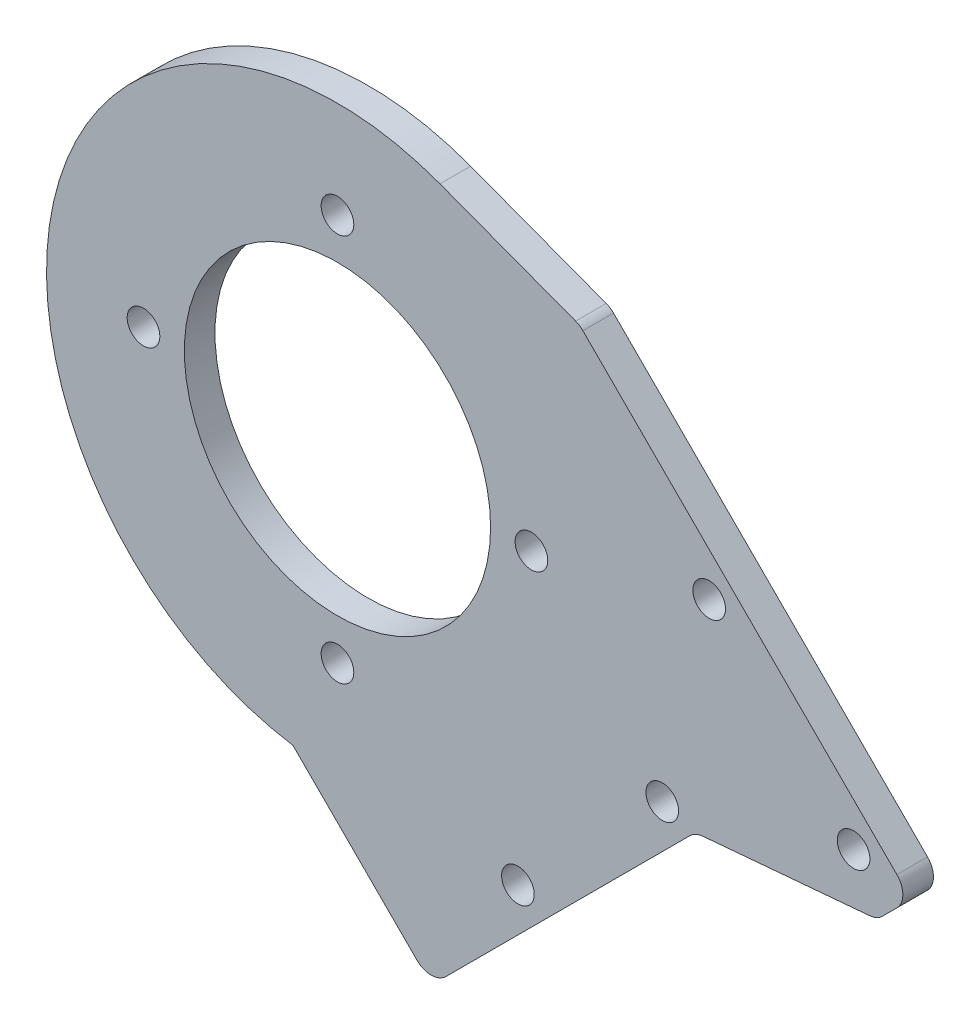
ISO-10303-21;
HEADER;
FILE_DESCRIPTION(('STEP AP214'),'2;1');
FILE_NAME('part.step','',(''),(''),'','','');
FILE_SCHEMA(('AUTOMOTIVE_DESIGN { 1 0 10303 214 1 1 1 1 }'));
ENDSEC;
DATA;
#1=APPLICATION_CONTEXT('core data for automotive mechanical design processes');
#2=APPLICATION_PROTOCOL_DEFINITION('international standard','automotive_design',2000,#1);
#3=PRODUCT_CONTEXT('',#1,'mechanical');
#4=PRODUCT('Part','Part','',(#3));
#5=PRODUCT_RELATED_PRODUCT_CATEGORY('part','',(#4));
#6=PRODUCT_DEFINITION_FORMATION('','',#4);
#7=PRODUCT_DEFINITION_CONTEXT('part definition',#1,'design');
#8=PRODUCT_DEFINITION('design','',#6,#7);
#9=PRODUCT_DEFINITION_SHAPE('','',#8);
#10=(LENGTH_UNIT() NAMED_UNIT(*) SI_UNIT(.MILLI.,.METRE.));
#11=(NAMED_UNIT(*) PLANE_ANGLE_UNIT() SI_UNIT($,.RADIAN.));
#12=(NAMED_UNIT(*) SI_UNIT($,.STERADIAN.) SOLID_ANGLE_UNIT());
#13=UNCERTAINTY_MEASURE_WITH_UNIT(LENGTH_MEASURE(1.E-05),#10,'distance_accuracy_value','');
#14=(GEOMETRIC_REPRESENTATION_CONTEXT(3) GLOBAL_UNCERTAINTY_ASSIGNED_CONTEXT((#13)) GLOBAL_UNIT_ASSIGNED_CONTEXT((#10,
#11,#12)) REPRESENTATION_CONTEXT('',''));
#15=CARTESIAN_POINT('',(0.,0.,0.));
#16=DIRECTION('',(0.,0.,1.));
#17=DIRECTION('',(1.,0.,0.));
#18=AXIS2_PLACEMENT_3D('',#15,#16,#17);
#19=CARTESIAN_POINT('',(0.,0.,3.));
#20=DIRECTION('',(0.,0.,-1.));
#21=DIRECTION('',(-1.,0.,0.));
#22=AXIS2_PLACEMENT_3D('',#19,#20,#21);
#23=CYLINDRICAL_SURFACE('',#22,28.5);
#24=CARTESIAN_POINT('',(0.,0.,3.));
#25=DIRECTION('',(0.,0.,1.));
#26=DIRECTION('',(1.,0.,0.));
#27=AXIS2_PLACEMENT_3D('',#24,#25,#26);
#28=CIRCLE('',#27,28.5);
#29=CARTESIAN_POINT('',(10.0381860912643,26.6736727879223,3.));
#30=VERTEX_POINT('',#29);
#31=CARTESIAN_POINT('',(-4.36282573187883,-28.1640862027025,3.));
#32=VERTEX_POINT('',#31);
#33=EDGE_CURVE('E11',#30,#32,#28,.T.);
#34=ORIENTED_EDGE('',*,*,#33,.F.);
#35=DIRECTION('',(0.,0.,1.));
#36=VECTOR('',#35,1.);
#37=CARTESIAN_POINT('',(10.0381860912643,26.6736727879223,-14.8069801070603));
#38=LINE('',#37,#36);
#39=CARTESIAN_POINT('',(10.0381860912643,26.6736727879223,0.));
#40=VERTEX_POINT('',#39);
#41=EDGE_CURVE('E135',#40,#30,#38,.T.);
#42=ORIENTED_EDGE('',*,*,#41,.F.);
#43=CARTESIAN_POINT('',(0.,0.,0.));
#44=DIRECTION('',(0.,0.,1.));
#45=DIRECTION('',(1.,0.,0.));
#46=AXIS2_PLACEMENT_3D('',#43,#44,#45);
#47=CIRCLE('',#46,28.5);
#48=CARTESIAN_POINT('',(-4.36282573187883,-28.1640862027025,0.));
#49=VERTEX_POINT('',#48);
#50=EDGE_CURVE('E49',#40,#49,#47,.T.);
#51=ORIENTED_EDGE('',*,*,#50,.T.);
#52=DIRECTION('',(0.,0.,1.));
#53=VECTOR('',#52,1.);
#54=CARTESIAN_POINT('',(-4.36282573187883,-28.1640862027025,-86.6025879209311));
#55=LINE('',#54,#53);
#56=EDGE_CURVE('E196',#49,#32,#55,.T.);
#57=ORIENTED_EDGE('',*,*,#56,.T.);
#58=EDGE_LOOP('',(#34,#42,#51,#57));
#59=FACE_BOUND('',#58,.T.);
#60=ADVANCED_FACE('F46',(#59),#23,.T.);
#61=CARTESIAN_POINT('',(0.,0.,3.));
#62=DIRECTION('',(0.,0.,1.));
#63=DIRECTION('',(1.,0.,0.));
#64=AXIS2_PLACEMENT_3D('',#61,#62,#63);
#65=PLANE('',#64);
#66=DIRECTION('',(-0.935918343435871,0.352217055833836,0.));
#67=VECTOR('',#66,1.);
#68=CARTESIAN_POINT('',(10.0381860912643,26.6736727879223,3.));
#69=LINE('',#68,#67);
#70=CARTESIAN_POINT('',(23.3318511096373,21.670826560095,3.));
#71=VERTEX_POINT('',#70);
#72=EDGE_CURVE('E133',#71,#30,#69,.T.);
#73=ORIENTED_EDGE('',*,*,#72,.T.);
#74=ORIENTED_EDGE('',*,*,#33,.T.);
#75=DIRECTION('',(-0.707106781186544,0.707106781186551,0.));
#76=VECTOR('',#75,1.);
#77=CARTESIAN_POINT('',(-16.2634559672907,-16.2634559672905,3.));
#78=LINE('',#77,#76);
#79=CARTESIAN_POINT('',(7.77817459305182,-40.3050865276332,3.));
#80=VERTEX_POINT('',#79);
#81=EDGE_CURVE('E172',#80,#32,#78,.T.);
#82=ORIENTED_EDGE('',*,*,#81,.F.);
#83=CARTESIAN_POINT('',(9.19238815542492,-38.8908729652602,3.));
#84=DIRECTION('',(0.,0.,1.));
#85=DIRECTION('',(1.,0.,0.));
#86=AXIS2_PLACEMENT_3D('',#83,#84,#85);
#87=CIRCLE('',#86,2.00000000000001);
#88=CARTESIAN_POINT('',(10.606601717798,-40.3050865276333,3.));
#89=VERTEX_POINT('',#88);
#90=EDGE_CURVE('E235',#89,#80,#87,.F.);
#91=ORIENTED_EDGE('',*,*,#90,.F.);
#92=DIRECTION('',(0.707106781186551,0.707106781186544,0.));
#93=VECTOR('',#92,1.);
#94=CARTESIAN_POINT('',(25.4558441227156,-25.4558441227158,3.));
#95=LINE('',#94,#93);
#96=CARTESIAN_POINT('',(34.5343546742321,-16.3773335711994,3.));
#97=VERTEX_POINT('',#96);
#98=EDGE_CURVE('E157',#89,#97,#95,.T.);
#99=ORIENTED_EDGE('',*,*,#98,.T.);
#100=CARTESIAN_POINT('',(35.9485682366052,-17.7915471335725,3.));
#101=DIRECTION('',(0.,0.,1.));
#102=DIRECTION('',(1.,0.,0.));
#103=AXIS2_PLACEMENT_3D('',#100,#101,#102);
#104=CIRCLE('',#103,2.00000000000001);
#105=CARTESIAN_POINT('',(35.7742567511099,-15.799157737389,3.));
#106=VERTEX_POINT('',#105);
#107=EDGE_CURVE('E164',#97,#106,#104,.F.);
#108=ORIENTED_EDGE('',*,*,#107,.T.);
#109=DIRECTION('',(0.996194698091746,0.0871557427476517,0.));
#110=VECTOR('',#109,1.);
#111=CARTESIAN_POINT('',(1.64349314706863,-18.7852126302256,3.));
#112=LINE('',#111,#110);
#113=CARTESIAN_POINT('',(52.1466599027065,-14.3667580669483,3.));
#114=VERTEX_POINT('',#113);
#115=EDGE_CURVE('E349',#106,#114,#112,.T.);
#116=ORIENTED_EDGE('',*,*,#115,.T.);
#117=CARTESIAN_POINT('',(51.9723484172112,-12.3743686707648,3.));
#118=DIRECTION('',(0.,0.,1.));
#119=DIRECTION('',(1.,0.,0.));
#120=AXIS2_PLACEMENT_3D('',#117,#118,#119);
#121=CIRCLE('',#120,2.);
#122=CARTESIAN_POINT('',(53.3865619795843,-13.7885822331379,3.));
#123=VERTEX_POINT('',#122);
#124=EDGE_CURVE('E259',#114,#123,#121,.T.);
#125=ORIENTED_EDGE('',*,*,#124,.T.);
#126=DIRECTION('',(-0.707106781186554,-0.707106781186542,0.));
#127=VECTOR('',#126,1.);
#128=CARTESIAN_POINT('',(33.5875721063607,-33.5875721063612,3.));
#129=LINE('',#128,#127);
#130=CARTESIAN_POINT('',(54.8007755419574,-12.3743686707649,3.));
#131=VERTEX_POINT('',#130);
#132=EDGE_CURVE('E217',#131,#123,#129,.T.);
#133=ORIENTED_EDGE('',*,*,#132,.F.);
#134=CARTESIAN_POINT('',(53.3865619795843,-10.9601551083918,3.));
#135=DIRECTION('',(0.,0.,1.));
#136=DIRECTION('',(1.,0.,0.));
#137=AXIS2_PLACEMENT_3D('',#134,#135,#136);
#138=CIRCLE('',#137,2.00000000000001);
#139=CARTESIAN_POINT('',(54.8007755419574,-9.54594154601867,3.));
#140=VERTEX_POINT('',#139);
#141=EDGE_CURVE('E213',#140,#131,#138,.F.);
#142=ORIENTED_EDGE('',*,*,#141,.F.);
#143=DIRECTION('',(0.707106781186544,-0.707106781186551,0.));
#144=VECTOR('',#143,1.);
#145=CARTESIAN_POINT('',(22.6274169979696,22.6274169979694,3.));
#146=LINE('',#145,#144);
#147=CARTESIAN_POINT('',(24.0416305603427,21.2132034355963,3.));
#148=VERTEX_POINT('',#147);
#149=EDGE_CURVE('E155',#148,#140,#146,.T.);
#150=ORIENTED_EDGE('',*,*,#149,.F.);
#151=CARTESIAN_POINT('',(22.6274169979696,19.7989898732232,3.));
#152=DIRECTION('',(0.,0.,1.));
#153=DIRECTION('',(1.,0.,0.));
#154=AXIS2_PLACEMENT_3D('',#151,#152,#153);
#155=CIRCLE('',#154,2.);
#156=EDGE_CURVE('E146',#148,#71,#155,.T.);
#157=ORIENTED_EDGE('',*,*,#156,.T.);
#158=EDGE_LOOP('',(#73,#74,#82,#91,#99,#108,#116,#125,#133,#142,#150,#157));
#159=FACE_BOUND('',#158,.T.);
#160=CARTESIAN_POINT('',(0.,-19.,3.));
#161=DIRECTION('',(0.,0.,1.));
#162=DIRECTION('',(1.,0.,0.));
#163=AXIS2_PLACEMENT_3D('',#160,#161,#162);
#164=CIRCLE('',#163,1.60000000000013);
#165=CARTESIAN_POINT('',(1.60000000000013,-19.,3.));
#166=VERTEX_POINT('',#165);
#167=EDGE_CURVE('E281',#166,#166,#164,.T.);
#168=ORIENTED_EDGE('',*,*,#167,.F.);
#169=EDGE_LOOP('',(#168));
#170=FACE_BOUND('',#169,.T.);
#171=CARTESIAN_POINT('',(0.,0.,3.));
#172=DIRECTION('',(0.,0.,1.));
#173=DIRECTION('',(1.,0.,0.));
#174=AXIS2_PLACEMENT_3D('',#171,#172,#173);
#175=CIRCLE('',#174,15.);
#176=CARTESIAN_POINT('',(15.,0.,3.));
#177=VERTEX_POINT('',#176);
#178=EDGE_CURVE('E296',#177,#177,#175,.T.);
#179=ORIENTED_EDGE('',*,*,#178,.F.);
#180=EDGE_LOOP('',(#179));
#181=FACE_BOUND('',#180,.T.);
#182=CARTESIAN_POINT('',(0.,19.,3.));
#183=DIRECTION('',(0.,0.,1.));
#184=DIRECTION('',(1.,0.,0.));
#185=AXIS2_PLACEMENT_3D('',#182,#183,#184);
#186=CIRCLE('',#185,1.6);
#187=CARTESIAN_POINT('',(1.6,19.,3.));
#188=VERTEX_POINT('',#187);
#189=EDGE_CURVE('E304',#188,#188,#186,.T.);
#190=ORIENTED_EDGE('',*,*,#189,.F.);
#191=EDGE_LOOP('',(#190));
#192=FACE_BOUND('',#191,.T.);
#193=CARTESIAN_POINT('',(19.,0.,3.));
#194=DIRECTION('',(0.,0.,1.));
#195=DIRECTION('',(1.,0.,0.));
#196=AXIS2_PLACEMENT_3D('',#193,#194,#195);
#197=CIRCLE('',#196,1.6);
#198=CARTESIAN_POINT('',(20.6,0.,3.));
#199=VERTEX_POINT('',#198);
#200=EDGE_CURVE('E288',#199,#199,#197,.T.);
#201=ORIENTED_EDGE('',*,*,#200,.F.);
#202=EDGE_LOOP('',(#201));
#203=FACE_BOUND('',#202,.T.);
#204=CARTESIAN_POINT('',(-19.,1.99014436314059E-13,3.));
#205=DIRECTION('',(0.,0.,1.));
#206=DIRECTION('',(1.,0.,0.));
#207=AXIS2_PLACEMENT_3D('',#204,#205,#206);
#208=CIRCLE('',#207,1.6);
#209=CARTESIAN_POINT('',(-17.4,1.99014436314059E-13,3.));
#210=VERTEX_POINT('',#209);
#211=EDGE_CURVE('E273',#210,#210,#208,.T.);
#212=ORIENTED_EDGE('',*,*,#211,.F.);
#213=EDGE_LOOP('',(#212));
#214=FACE_BOUND('',#213,.T.);
#215=CARTESIAN_POINT('',(31.8198051533946,-14.8492424049177,3.));
#216=DIRECTION('',(0.,0.,1.));
#217=DIRECTION('',(1.,0.,0.));
#218=AXIS2_PLACEMENT_3D('',#215,#216,#217);
#219=CIRCLE('',#218,1.59999999999999);
#220=CARTESIAN_POINT('',(33.4198051533946,-14.8492424049177,3.));
#221=VERTEX_POINT('',#220);
#222=EDGE_CURVE('E158',#221,#221,#219,.T.);
#223=ORIENTED_EDGE('',*,*,#222,.F.);
#224=EDGE_LOOP('',(#223));
#225=FACE_BOUND('',#224,.T.);
#226=CARTESIAN_POINT('',(17.6776695296635,-28.9913780286485,3.));
#227=DIRECTION('',(0.,0.,1.));
#228=DIRECTION('',(1.,0.,0.));
#229=AXIS2_PLACEMENT_3D('',#226,#227,#228);
#230=CIRCLE('',#229,1.59999999999999);
#231=CARTESIAN_POINT('',(19.2776695296635,-28.9913780286485,3.));
#232=VERTEX_POINT('',#231);
#233=EDGE_CURVE('E189',#232,#232,#230,.T.);
#234=ORIENTED_EDGE('',*,*,#233,.F.);
#235=EDGE_LOOP('',(#234));
#236=FACE_BOUND('',#235,.T.);
#237=CARTESIAN_POINT('',(50.5581348548377,-9.54594154601909,3.));
#238=DIRECTION('',(0.,0.,1.));
#239=DIRECTION('',(1.,0.,0.));
#240=AXIS2_PLACEMENT_3D('',#237,#238,#239);
#241=CIRCLE('',#240,1.59999999999999);
#242=CARTESIAN_POINT('',(52.1581348548377,-9.54594154601909,3.));
#243=VERTEX_POINT('',#242);
#244=EDGE_CURVE('E184',#243,#243,#241,.T.);
#245=ORIENTED_EDGE('',*,*,#244,.F.);
#246=EDGE_LOOP('',(#245));
#247=FACE_BOUND('',#246,.T.);
#248=CARTESIAN_POINT('',(36.4159992311068,4.59619407771193,3.));
#249=DIRECTION('',(0.,0.,1.));
#250=DIRECTION('',(1.,0.,0.));
#251=AXIS2_PLACEMENT_3D('',#248,#249,#250);
#252=CIRCLE('',#251,1.60000000000002);
#253=CARTESIAN_POINT('',(38.0159992311068,4.59619407771193,3.));
#254=VERTEX_POINT('',#253);
#255=EDGE_CURVE('E178',#254,#254,#252,.T.);
#256=ORIENTED_EDGE('',*,*,#255,.F.);
#257=EDGE_LOOP('',(#256));
#258=FACE_BOUND('',#257,.T.);
#259=ADVANCED_FACE('F151',(#159,#170,#181,#192,#203,#214,#225,#236,#247,#258),#65,.T.);
#260=CARTESIAN_POINT('',(0.,0.,0.));
#261=DIRECTION('',(0.,0.,1.));
#262=DIRECTION('',(1.,0.,0.));
#263=AXIS2_PLACEMENT_3D('',#260,#261,#262);
#264=PLANE('',#263);
#265=ORIENTED_EDGE('',*,*,#50,.F.);
#266=DIRECTION('',(0.935918343435871,-0.352217055833836,0.));
#267=VECTOR('',#266,1.);
#268=CARTESIAN_POINT('',(10.0381860912643,26.6736727879223,0.));
#269=LINE('',#268,#267);
#270=CARTESIAN_POINT('',(23.3318511096373,21.670826560095,0.));
#271=VERTEX_POINT('',#270);
#272=EDGE_CURVE('E248',#40,#271,#269,.T.);
#273=ORIENTED_EDGE('',*,*,#272,.T.);
#274=CARTESIAN_POINT('',(22.6274169979696,19.7989898732232,0.));
#275=DIRECTION('',(0.,0.,1.));
#276=DIRECTION('',(1.,0.,0.));
#277=AXIS2_PLACEMENT_3D('',#274,#275,#276);
#278=CIRCLE('',#277,2.);
#279=CARTESIAN_POINT('',(24.0416305603427,21.2132034355963,0.));
#280=VERTEX_POINT('',#279);
#281=EDGE_CURVE('E147',#271,#280,#278,.F.);
#282=ORIENTED_EDGE('',*,*,#281,.T.);
#283=DIRECTION('',(-0.707106781186544,0.707106781186551,0.));
#284=VECTOR('',#283,1.);
#285=CARTESIAN_POINT('',(22.6274169979696,22.6274169979694,0.));
#286=LINE('',#285,#284);
#287=CARTESIAN_POINT('',(54.8007755419574,-9.54594154601866,0.));
#288=VERTEX_POINT('',#287);
#289=EDGE_CURVE('E244',#288,#280,#286,.T.);
#290=ORIENTED_EDGE('',*,*,#289,.F.);
#291=CARTESIAN_POINT('',(53.3865619795843,-10.9601551083918,0.));
#292=DIRECTION('',(0.,0.,1.));
#293=DIRECTION('',(1.,0.,0.));
#294=AXIS2_PLACEMENT_3D('',#291,#292,#293);
#295=CIRCLE('',#294,2.00000000000001);
#296=CARTESIAN_POINT('',(54.8007755419574,-12.3743686707649,0.));
#297=VERTEX_POINT('',#296);
#298=EDGE_CURVE('E176',#297,#288,#295,.T.);
#299=ORIENTED_EDGE('',*,*,#298,.F.);
#300=DIRECTION('',(0.707106781186554,0.707106781186542,0.));
#301=VECTOR('',#300,1.);
#302=CARTESIAN_POINT('',(33.5875721063607,-33.5875721063612,0.));
#303=LINE('',#302,#301);
#304=CARTESIAN_POINT('',(53.3865619795843,-13.7885822331379,0.));
#305=VERTEX_POINT('',#304);
#306=EDGE_CURVE('E218',#305,#297,#303,.T.);
#307=ORIENTED_EDGE('',*,*,#306,.F.);
#308=CARTESIAN_POINT('',(51.9723484172112,-12.3743686707648,0.));
#309=DIRECTION('',(0.,0.,1.));
#310=DIRECTION('',(1.,0.,0.));
#311=AXIS2_PLACEMENT_3D('',#308,#309,#310);
#312=CIRCLE('',#311,2.);
#313=CARTESIAN_POINT('',(52.1466599027065,-14.3667580669483,0.));
#314=VERTEX_POINT('',#313);
#315=EDGE_CURVE('E255',#305,#314,#312,.F.);
#316=ORIENTED_EDGE('',*,*,#315,.T.);
#317=DIRECTION('',(-0.996194698091746,-0.0871557427476517,0.));
#318=VECTOR('',#317,1.);
#319=CARTESIAN_POINT('',(1.64349314706863,-18.7852126302256,0.));
#320=LINE('',#319,#318);
#321=CARTESIAN_POINT('',(35.7742567511099,-15.799157737389,0.));
#322=VERTEX_POINT('',#321);
#323=EDGE_CURVE('E258',#314,#322,#320,.T.);
#324=ORIENTED_EDGE('',*,*,#323,.T.);
#325=CARTESIAN_POINT('',(35.9485682366052,-17.7915471335725,0.));
#326=DIRECTION('',(0.,0.,1.));
#327=DIRECTION('',(1.,0.,0.));
#328=AXIS2_PLACEMENT_3D('',#325,#326,#327);
#329=CIRCLE('',#328,2.00000000000001);
#330=CARTESIAN_POINT('',(34.5343546742321,-16.3773335711994,0.));
#331=VERTEX_POINT('',#330);
#332=EDGE_CURVE('E262',#322,#331,#329,.T.);
#333=ORIENTED_EDGE('',*,*,#332,.T.);
#334=DIRECTION('',(-0.707106781186551,-0.707106781186544,0.));
#335=VECTOR('',#334,1.);
#336=CARTESIAN_POINT('',(25.4558441227156,-25.4558441227158,0.));
#337=LINE('',#336,#335);
#338=CARTESIAN_POINT('',(10.606601717798,-40.3050865276333,0.));
#339=VERTEX_POINT('',#338);
#340=EDGE_CURVE('E209',#331,#339,#337,.T.);
#341=ORIENTED_EDGE('',*,*,#340,.T.);
#342=CARTESIAN_POINT('',(9.19238815542492,-38.8908729652602,0.));
#343=DIRECTION('',(0.,0.,1.));
#344=DIRECTION('',(1.,0.,0.));
#345=AXIS2_PLACEMENT_3D('',#342,#343,#344);
#346=CIRCLE('',#345,2.00000000000001);
#347=CARTESIAN_POINT('',(7.77817459305181,-40.3050865276332,0.));
#348=VERTEX_POINT('',#347);
#349=EDGE_CURVE('E231',#348,#339,#346,.T.);
#350=ORIENTED_EDGE('',*,*,#349,.F.);
#351=DIRECTION('',(0.707106781186544,-0.707106781186551,0.));
#352=VECTOR('',#351,1.);
#353=CARTESIAN_POINT('',(-16.2634559672907,-16.2634559672905,0.));
#354=LINE('',#353,#352);
#355=EDGE_CURVE('E239',#49,#348,#354,.T.);
#356=ORIENTED_EDGE('',*,*,#355,.F.);
#357=EDGE_LOOP('',(#265,#273,#282,#290,#299,#307,#316,#324,#333,#341,#350,#356));
#358=FACE_BOUND('',#357,.T.);
#359=CARTESIAN_POINT('',(0.,19.,0.));
#360=DIRECTION('',(0.,0.,1.));
#361=DIRECTION('',(1.,0.,0.));
#362=AXIS2_PLACEMENT_3D('',#359,#360,#361);
#363=CIRCLE('',#362,1.6);
#364=CARTESIAN_POINT('',(1.6,19.,0.));
#365=VERTEX_POINT('',#364);
#366=EDGE_CURVE('E300',#365,#365,#363,.T.);
#367=ORIENTED_EDGE('',*,*,#366,.T.);
#368=EDGE_LOOP('',(#367));
#369=FACE_BOUND('',#368,.T.);
#370=CARTESIAN_POINT('',(0.,0.,0.));
#371=DIRECTION('',(0.,0.,1.));
#372=DIRECTION('',(1.,0.,0.));
#373=AXIS2_PLACEMENT_3D('',#370,#371,#372);
#374=CIRCLE('',#373,15.);
#375=CARTESIAN_POINT('',(15.,0.,0.));
#376=VERTEX_POINT('',#375);
#377=EDGE_CURVE('E292',#376,#376,#374,.T.);
#378=ORIENTED_EDGE('',*,*,#377,.T.);
#379=EDGE_LOOP('',(#378));
#380=FACE_BOUND('',#379,.T.);
#381=CARTESIAN_POINT('',(19.,0.,0.));
#382=DIRECTION('',(0.,0.,1.));
#383=DIRECTION('',(1.,0.,0.));
#384=AXIS2_PLACEMENT_3D('',#381,#382,#383);
#385=CIRCLE('',#384,1.6);
#386=CARTESIAN_POINT('',(20.6,0.,0.));
#387=VERTEX_POINT('',#386);
#388=EDGE_CURVE('E284',#387,#387,#385,.T.);
#389=ORIENTED_EDGE('',*,*,#388,.T.);
#390=EDGE_LOOP('',(#389));
#391=FACE_BOUND('',#390,.T.);
#392=CARTESIAN_POINT('',(0.,-19.,0.));
#393=DIRECTION('',(0.,0.,1.));
#394=DIRECTION('',(1.,0.,0.));
#395=AXIS2_PLACEMENT_3D('',#392,#393,#394);
#396=CIRCLE('',#395,1.60000000000013);
#397=CARTESIAN_POINT('',(1.60000000000013,-19.,0.));
#398=VERTEX_POINT('',#397);
#399=EDGE_CURVE('E277',#398,#398,#396,.T.);
#400=ORIENTED_EDGE('',*,*,#399,.T.);
#401=EDGE_LOOP('',(#400));
#402=FACE_BOUND('',#401,.T.);
#403=CARTESIAN_POINT('',(-19.,1.99014436314059E-13,0.));
#404=DIRECTION('',(0.,0.,1.));
#405=DIRECTION('',(1.,0.,0.));
#406=AXIS2_PLACEMENT_3D('',#403,#404,#405);
#407=CIRCLE('',#406,1.6);
#408=CARTESIAN_POINT('',(-17.4,1.99014436314059E-13,0.));
#409=VERTEX_POINT('',#408);
#410=EDGE_CURVE('E208',#409,#409,#407,.T.);
#411=ORIENTED_EDGE('',*,*,#410,.T.);
#412=EDGE_LOOP('',(#411));
#413=FACE_BOUND('',#412,.T.);
#414=CARTESIAN_POINT('',(50.5581348548377,-9.54594154601909,0.));
#415=DIRECTION('',(0.,0.,1.));
#416=DIRECTION('',(1.,0.,0.));
#417=AXIS2_PLACEMENT_3D('',#414,#415,#416);
#418=CIRCLE('',#417,1.59999999999999);
#419=CARTESIAN_POINT('',(52.1581348548377,-9.54594154601909,0.));
#420=VERTEX_POINT('',#419);
#421=EDGE_CURVE('E182',#420,#420,#418,.F.);
#422=ORIENTED_EDGE('',*,*,#421,.F.);
#423=EDGE_LOOP('',(#422));
#424=FACE_BOUND('',#423,.T.);
#425=CARTESIAN_POINT('',(31.8198051533946,-14.8492424049177,0.));
#426=DIRECTION('',(0.,0.,1.));
#427=DIRECTION('',(1.,0.,0.));
#428=AXIS2_PLACEMENT_3D('',#425,#426,#427);
#429=CIRCLE('',#428,1.59999999999999);
#430=CARTESIAN_POINT('',(33.4198051533946,-14.8492424049177,0.));
#431=VERTEX_POINT('',#430);
#432=EDGE_CURVE('E168',#431,#431,#429,.F.);
#433=ORIENTED_EDGE('',*,*,#432,.F.);
#434=EDGE_LOOP('',(#433));
#435=FACE_BOUND('',#434,.T.);
#436=CARTESIAN_POINT('',(17.6776695296635,-28.9913780286485,0.));
#437=DIRECTION('',(0.,0.,1.));
#438=DIRECTION('',(1.,0.,0.));
#439=AXIS2_PLACEMENT_3D('',#436,#437,#438);
#440=CIRCLE('',#439,1.59999999999999);
#441=CARTESIAN_POINT('',(19.2776695296635,-28.9913780286485,0.));
#442=VERTEX_POINT('',#441);
#443=EDGE_CURVE('E188',#442,#442,#440,.F.);
#444=ORIENTED_EDGE('',*,*,#443,.F.);
#445=EDGE_LOOP('',(#444));
#446=FACE_BOUND('',#445,.T.);
#447=CARTESIAN_POINT('',(36.4159992311068,4.59619407771193,0.));
#448=DIRECTION('',(0.,0.,1.));
#449=DIRECTION('',(1.,0.,0.));
#450=AXIS2_PLACEMENT_3D('',#447,#448,#449);
#451=CIRCLE('',#450,1.60000000000002);
#452=CARTESIAN_POINT('',(38.0159992311068,4.59619407771193,0.));
#453=VERTEX_POINT('',#452);
#454=EDGE_CURVE('E183',#453,#453,#451,.F.);
#455=ORIENTED_EDGE('',*,*,#454,.F.);
#456=EDGE_LOOP('',(#455));
#457=FACE_BOUND('',#456,.T.);
#458=ADVANCED_FACE('F312',(#358,#369,#380,#391,#402,#413,#424,#435,#446,#457),#264,.F.);
#459=CARTESIAN_POINT('',(0.,19.,3.));
#460=DIRECTION('',(0.,0.,-1.));
#461=DIRECTION('',(-1.,0.,0.));
#462=AXIS2_PLACEMENT_3D('',#459,#460,#461);
#463=CYLINDRICAL_SURFACE('',#462,1.6);
#464=ORIENTED_EDGE('',*,*,#189,.T.);
#465=EDGE_LOOP('',(#464));
#466=FACE_BOUND('',#465,.T.);
#467=ORIENTED_EDGE('',*,*,#366,.F.);
#468=EDGE_LOOP('',(#467));
#469=FACE_BOUND('',#468,.T.);
#470=ADVANCED_FACE('F315',(#466,#469),#463,.F.);
#471=CARTESIAN_POINT('',(0.,0.,3.));
#472=DIRECTION('',(0.,0.,-1.));
#473=DIRECTION('',(-1.,0.,0.));
#474=AXIS2_PLACEMENT_3D('',#471,#472,#473);
#475=CYLINDRICAL_SURFACE('',#474,15.);
#476=ORIENTED_EDGE('',*,*,#178,.T.);
#477=EDGE_LOOP('',(#476));
#478=FACE_BOUND('',#477,.T.);
#479=ORIENTED_EDGE('',*,*,#377,.F.);
#480=EDGE_LOOP('',(#479));
#481=FACE_BOUND('',#480,.T.);
#482=ADVANCED_FACE('F317',(#478,#481),#475,.F.);
#483=CARTESIAN_POINT('',(19.,0.,3.));
#484=DIRECTION('',(0.,0.,-1.));
#485=DIRECTION('',(-1.,0.,0.));
#486=AXIS2_PLACEMENT_3D('',#483,#484,#485);
#487=CYLINDRICAL_SURFACE('',#486,1.6);
#488=ORIENTED_EDGE('',*,*,#200,.T.);
#489=EDGE_LOOP('',(#488));
#490=FACE_BOUND('',#489,.T.);
#491=ORIENTED_EDGE('',*,*,#388,.F.);
#492=EDGE_LOOP('',(#491));
#493=FACE_BOUND('',#492,.T.);
#494=ADVANCED_FACE('F323',(#490,#493),#487,.F.);
#495=CARTESIAN_POINT('',(0.,-19.,3.));
#496=DIRECTION('',(0.,0.,-1.));
#497=DIRECTION('',(-1.,0.,0.));
#498=AXIS2_PLACEMENT_3D('',#495,#496,#497);
#499=CYLINDRICAL_SURFACE('',#498,1.60000000000013);
#500=ORIENTED_EDGE('',*,*,#167,.T.);
#501=EDGE_LOOP('',(#500));
#502=FACE_BOUND('',#501,.T.);
#503=ORIENTED_EDGE('',*,*,#399,.F.);
#504=EDGE_LOOP('',(#503));
#505=FACE_BOUND('',#504,.T.);
#506=ADVANCED_FACE('F422',(#502,#505),#499,.F.);
#507=CARTESIAN_POINT('',(-19.,1.99014436314059E-13,3.));
#508=DIRECTION('',(0.,0.,-1.));
#509=DIRECTION('',(-1.,0.,0.));
#510=AXIS2_PLACEMENT_3D('',#507,#508,#509);
#511=CYLINDRICAL_SURFACE('',#510,1.6);
#512=ORIENTED_EDGE('',*,*,#211,.T.);
#513=EDGE_LOOP('',(#512));
#514=FACE_BOUND('',#513,.T.);
#515=ORIENTED_EDGE('',*,*,#410,.F.);
#516=EDGE_LOOP('',(#515));
#517=FACE_BOUND('',#516,.T.);
#518=ADVANCED_FACE('F419',(#514,#517),#511,.F.);
#519=CARTESIAN_POINT('',(22.6274169979696,22.6274169979694,-86.6025879209311));
#520=DIRECTION('',(-0.707106781186551,-0.707106781186544,0.));
#521=DIRECTION('',(0.707106781186544,-0.707106781186551,0.));
#522=AXIS2_PLACEMENT_3D('',#519,#520,#521);
#523=PLANE('',#522);
#524=DIRECTION('',(0.,0.,1.));
#525=VECTOR('',#524,1.);
#526=CARTESIAN_POINT('',(54.8007755419574,-9.54594154601867,-86.6025879209311));
#527=LINE('',#526,#525);
#528=EDGE_CURVE('E210',#288,#140,#527,.T.);
#529=ORIENTED_EDGE('',*,*,#528,.F.);
#530=ORIENTED_EDGE('',*,*,#289,.T.);
#531=DIRECTION('',(0.,0.,1.));
#532=VECTOR('',#531,1.);
#533=CARTESIAN_POINT('',(24.0416305603427,21.2132034355963,-86.6025879209311));
#534=LINE('',#533,#532);
#535=EDGE_CURVE('E177',#280,#148,#534,.T.);
#536=ORIENTED_EDGE('',*,*,#535,.T.);
#537=ORIENTED_EDGE('',*,*,#149,.T.);
#538=EDGE_LOOP('',(#529,#530,#536,#537));
#539=FACE_BOUND('',#538,.T.);
#540=ADVANCED_FACE('F389',(#539),#523,.F.);
#541=CARTESIAN_POINT('',(53.3865619795843,-10.9601551083918,-86.6025879209311));
#542=DIRECTION('',(0.,0.,1.));
#543=DIRECTION('',(1.,0.,0.));
#544=AXIS2_PLACEMENT_3D('',#541,#542,#543);
#545=CYLINDRICAL_SURFACE('',#544,2.00000000000001);
#546=DIRECTION('',(0.,0.,1.));
#547=VECTOR('',#546,1.);
#548=CARTESIAN_POINT('',(54.8007755419574,-12.3743686707649,-86.6025879209311));
#549=LINE('',#548,#547);
#550=EDGE_CURVE('E214',#297,#131,#549,.T.);
#551=ORIENTED_EDGE('',*,*,#550,.F.);
#552=ORIENTED_EDGE('',*,*,#298,.T.);
#553=ORIENTED_EDGE('',*,*,#528,.T.);
#554=ORIENTED_EDGE('',*,*,#141,.T.);
#555=EDGE_LOOP('',(#551,#552,#553,#554));
#556=FACE_BOUND('',#555,.T.);
#557=ADVANCED_FACE('F386',(#556),#545,.T.);
#558=CARTESIAN_POINT('',(33.5875721063607,-33.5875721063612,-86.6025879209311));
#559=DIRECTION('',(-0.707106781186542,0.707106781186554,0.));
#560=DIRECTION('',(-0.707106781186554,-0.707106781186542,0.));
#561=AXIS2_PLACEMENT_3D('',#558,#559,#560);
#562=PLANE('',#561);
#563=DIRECTION('',(0.,0.,1.));
#564=VECTOR('',#563,1.);
#565=CARTESIAN_POINT('',(53.3865619795843,-13.7885822331379,-86.6025879209311));
#566=LINE('',#565,#564);
#567=EDGE_CURVE('E219',#305,#123,#566,.T.);
#568=ORIENTED_EDGE('',*,*,#567,.F.);
#569=ORIENTED_EDGE('',*,*,#306,.T.);
#570=ORIENTED_EDGE('',*,*,#550,.T.);
#571=ORIENTED_EDGE('',*,*,#132,.T.);
#572=EDGE_LOOP('',(#568,#569,#570,#571));
#573=FACE_BOUND('',#572,.T.);
#574=ADVANCED_FACE('F383',(#573),#562,.F.);
#575=CARTESIAN_POINT('',(51.9723484172112,-12.3743686707648,-86.6025879209311));
#576=DIRECTION('',(0.,0.,1.));
#577=DIRECTION('',(1.,0.,0.));
#578=AXIS2_PLACEMENT_3D('',#575,#576,#577);
#579=CYLINDRICAL_SURFACE('',#578,2.);
#580=ORIENTED_EDGE('',*,*,#315,.F.);
#581=ORIENTED_EDGE('',*,*,#567,.T.);
#582=ORIENTED_EDGE('',*,*,#124,.F.);
#583=DIRECTION('',(0.,0.,1.));
#584=VECTOR('',#583,1.);
#585=CARTESIAN_POINT('',(52.1466599027065,-14.3667580669483,-86.6025879209311));
#586=LINE('',#585,#584);
#587=EDGE_CURVE('E222',#314,#114,#586,.T.);
#588=ORIENTED_EDGE('',*,*,#587,.F.);
#589=EDGE_LOOP('',(#580,#581,#582,#588));
#590=FACE_BOUND('',#589,.T.);
#591=ADVANCED_FACE('F410',(#590),#579,.T.);
#592=CARTESIAN_POINT('',(1.64349314706863,-18.7852126302256,-86.6025879209311));
#593=DIRECTION('',(0.0871557427476517,-0.996194698091746,0.));
#594=DIRECTION('',(0.996194698091746,0.0871557427476517,0.));
#595=AXIS2_PLACEMENT_3D('',#592,#593,#594);
#596=PLANE('',#595);
#597=ORIENTED_EDGE('',*,*,#323,.F.);
#598=ORIENTED_EDGE('',*,*,#587,.T.);
#599=ORIENTED_EDGE('',*,*,#115,.F.);
#600=DIRECTION('',(0.,0.,1.));
#601=VECTOR('',#600,1.);
#602=CARTESIAN_POINT('',(35.7742567511099,-15.799157737389,-86.6025879209311));
#603=LINE('',#602,#601);
#604=EDGE_CURVE('E225',#322,#106,#603,.T.);
#605=ORIENTED_EDGE('',*,*,#604,.F.);
#606=EDGE_LOOP('',(#597,#598,#599,#605));
#607=FACE_BOUND('',#606,.T.);
#608=ADVANCED_FACE('F371',(#607),#596,.T.);
#609=CARTESIAN_POINT('',(35.9485682366052,-17.7915471335725,-86.6025879209311));
#610=DIRECTION('',(0.,0.,1.));
#611=DIRECTION('',(1.,0.,0.));
#612=AXIS2_PLACEMENT_3D('',#609,#610,#611);
#613=CYLINDRICAL_SURFACE('',#612,2.00000000000001);
#614=ORIENTED_EDGE('',*,*,#332,.F.);
#615=ORIENTED_EDGE('',*,*,#604,.T.);
#616=ORIENTED_EDGE('',*,*,#107,.F.);
#617=DIRECTION('',(0.,0.,1.));
#618=VECTOR('',#617,1.);
#619=CARTESIAN_POINT('',(34.5343546742321,-16.3773335711994,-86.6025879209311));
#620=LINE('',#619,#618);
#621=EDGE_CURVE('E228',#331,#97,#620,.T.);
#622=ORIENTED_EDGE('',*,*,#621,.F.);
#623=EDGE_LOOP('',(#614,#615,#616,#622));
#624=FACE_BOUND('',#623,.T.);
#625=ADVANCED_FACE('F366',(#624),#613,.F.);
#626=CARTESIAN_POINT('',(25.4558441227156,-25.4558441227158,-86.6025879209311));
#627=DIRECTION('',(0.707106781186544,-0.707106781186551,0.));
#628=DIRECTION('',(0.707106781186551,0.707106781186544,0.));
#629=AXIS2_PLACEMENT_3D('',#626,#627,#628);
#630=PLANE('',#629);
#631=ORIENTED_EDGE('',*,*,#340,.F.);
#632=ORIENTED_EDGE('',*,*,#621,.T.);
#633=ORIENTED_EDGE('',*,*,#98,.F.);
#634=DIRECTION('',(0.,0.,1.));
#635=VECTOR('',#634,1.);
#636=CARTESIAN_POINT('',(10.606601717798,-40.3050865276333,-86.6025879209311));
#637=LINE('',#636,#635);
#638=EDGE_CURVE('E232',#339,#89,#637,.T.);
#639=ORIENTED_EDGE('',*,*,#638,.F.);
#640=EDGE_LOOP('',(#631,#632,#633,#639));
#641=FACE_BOUND('',#640,.T.);
#642=ADVANCED_FACE('F362',(#641),#630,.T.);
#643=CARTESIAN_POINT('',(9.19238815542492,-38.8908729652602,-86.6025879209311));
#644=DIRECTION('',(0.,0.,1.));
#645=DIRECTION('',(1.,0.,0.));
#646=AXIS2_PLACEMENT_3D('',#643,#644,#645);
#647=CYLINDRICAL_SURFACE('',#646,2.00000000000001);
#648=DIRECTION('',(0.,0.,1.));
#649=VECTOR('',#648,1.);
#650=CARTESIAN_POINT('',(7.77817459305182,-40.3050865276332,-86.6025879209311));
#651=LINE('',#650,#649);
#652=EDGE_CURVE('E236',#348,#80,#651,.T.);
#653=ORIENTED_EDGE('',*,*,#652,.F.);
#654=ORIENTED_EDGE('',*,*,#349,.T.);
#655=ORIENTED_EDGE('',*,*,#638,.T.);
#656=ORIENTED_EDGE('',*,*,#90,.T.);
#657=EDGE_LOOP('',(#653,#654,#655,#656));
#658=FACE_BOUND('',#657,.T.);
#659=ADVANCED_FACE('F358',(#658),#647,.T.);
#660=CARTESIAN_POINT('',(-16.2634559672907,-16.2634559672905,-86.6025879209311));
#661=DIRECTION('',(0.707106781186551,0.707106781186544,0.));
#662=DIRECTION('',(-0.707106781186544,0.707106781186551,0.));
#663=AXIS2_PLACEMENT_3D('',#660,#661,#662);
#664=PLANE('',#663);
#665=ORIENTED_EDGE('',*,*,#56,.F.);
#666=ORIENTED_EDGE('',*,*,#355,.T.);
#667=ORIENTED_EDGE('',*,*,#652,.T.);
#668=ORIENTED_EDGE('',*,*,#81,.T.);
#669=EDGE_LOOP('',(#665,#666,#667,#668));
#670=FACE_BOUND('',#669,.T.);
#671=ADVANCED_FACE('F390',(#670),#664,.F.);
#672=CARTESIAN_POINT('',(36.4159992311068,4.59619407771193,-86.6025879209311));
#673=DIRECTION('',(0.,0.,1.));
#674=DIRECTION('',(1.,0.,0.));
#675=AXIS2_PLACEMENT_3D('',#672,#673,#674);
#676=CYLINDRICAL_SURFACE('',#675,1.60000000000002);
#677=ORIENTED_EDGE('',*,*,#454,.T.);
#678=EDGE_LOOP('',(#677));
#679=FACE_BOUND('',#678,.T.);
#680=ORIENTED_EDGE('',*,*,#255,.T.);
#681=EDGE_LOOP('',(#680));
#682=FACE_BOUND('',#681,.T.);
#683=ADVANCED_FACE('F392',(#679,#682),#676,.F.);
#684=CARTESIAN_POINT('',(50.5581348548377,-9.54594154601909,-86.6025879209311));
#685=DIRECTION('',(0.,0.,1.));
#686=DIRECTION('',(1.,0.,0.));
#687=AXIS2_PLACEMENT_3D('',#684,#685,#686);
#688=CYLINDRICAL_SURFACE('',#687,1.59999999999999);
#689=ORIENTED_EDGE('',*,*,#421,.T.);
#690=EDGE_LOOP('',(#689));
#691=FACE_BOUND('',#690,.T.);
#692=ORIENTED_EDGE('',*,*,#244,.T.);
#693=EDGE_LOOP('',(#692));
#694=FACE_BOUND('',#693,.T.);
#695=ADVANCED_FACE('F397',(#691,#694),#688,.F.);
#696=CARTESIAN_POINT('',(17.6776695296635,-28.9913780286485,-86.6025879209311));
#697=DIRECTION('',(0.,0.,1.));
#698=DIRECTION('',(1.,0.,0.));
#699=AXIS2_PLACEMENT_3D('',#696,#697,#698);
#700=CYLINDRICAL_SURFACE('',#699,1.59999999999999);
#701=ORIENTED_EDGE('',*,*,#443,.T.);
#702=EDGE_LOOP('',(#701));
#703=FACE_BOUND('',#702,.T.);
#704=ORIENTED_EDGE('',*,*,#233,.T.);
#705=EDGE_LOOP('',(#704));
#706=FACE_BOUND('',#705,.T.);
#707=ADVANCED_FACE('F450',(#703,#706),#700,.F.);
#708=CARTESIAN_POINT('',(31.8198051533946,-14.8492424049177,-86.6025879209311));
#709=DIRECTION('',(0.,0.,1.));
#710=DIRECTION('',(1.,0.,0.));
#711=AXIS2_PLACEMENT_3D('',#708,#709,#710);
#712=CYLINDRICAL_SURFACE('',#711,1.59999999999999);
#713=ORIENTED_EDGE('',*,*,#432,.T.);
#714=EDGE_LOOP('',(#713));
#715=FACE_BOUND('',#714,.T.);
#716=ORIENTED_EDGE('',*,*,#222,.T.);
#717=EDGE_LOOP('',(#716));
#718=FACE_BOUND('',#717,.T.);
#719=ADVANCED_FACE('F453',(#715,#718),#712,.F.);
#720=CARTESIAN_POINT('',(22.6274169979696,19.7989898732232,-86.6025879209311));
#721=DIRECTION('',(0.,0.,1.));
#722=DIRECTION('',(1.,0.,0.));
#723=AXIS2_PLACEMENT_3D('',#720,#721,#722);
#724=CYLINDRICAL_SURFACE('',#723,2.);
#725=DIRECTION('',(0.,0.,1.));
#726=VECTOR('',#725,1.);
#727=CARTESIAN_POINT('',(23.3318511096373,21.670826560095,-14.8069801070603));
#728=LINE('',#727,#726);
#729=EDGE_CURVE('E61',#271,#71,#728,.T.);
#730=ORIENTED_EDGE('',*,*,#729,.T.);
#731=ORIENTED_EDGE('',*,*,#156,.F.);
#732=ORIENTED_EDGE('',*,*,#535,.F.);
#733=ORIENTED_EDGE('',*,*,#281,.F.);
#734=EDGE_LOOP('',(#730,#731,#732,#733));
#735=FACE_BOUND('',#734,.T.);
#736=ADVANCED_FACE('F144',(#735),#724,.T.);
#737=CARTESIAN_POINT('',(10.0381860912643,26.6736727879223,-14.8069801070603));
#738=DIRECTION('',(0.352217055833836,0.935918343435871,0.));
#739=DIRECTION('',(-0.935918343435871,0.352217055833836,0.));
#740=AXIS2_PLACEMENT_3D('',#737,#738,#739);
#741=PLANE('',#740);
#742=ORIENTED_EDGE('',*,*,#272,.F.);
#743=ORIENTED_EDGE('',*,*,#41,.T.);
#744=ORIENTED_EDGE('',*,*,#72,.F.);
#745=ORIENTED_EDGE('',*,*,#729,.F.);
#746=EDGE_LOOP('',(#742,#743,#744,#745));
#747=FACE_BOUND('',#746,.T.);
#748=ADVANCED_FACE('F134',(#747),#741,.T.);
#749=CLOSED_SHELL('',(#60,#259,#458,#470,#482,#494,#506,#518,#540,#557,#574,#591,#608,#625,#642,
#659,#671,#683,#695,#707,#719,#736,#748));
#750=MANIFOLD_SOLID_BREP('B2',#749);
#751=ADVANCED_BREP_SHAPE_REPRESENTATION('',(#18,#750),#14);
#752=SHAPE_DEFINITION_REPRESENTATION(#9,#751);
ENDSEC;
END-ISO-10303-21;
